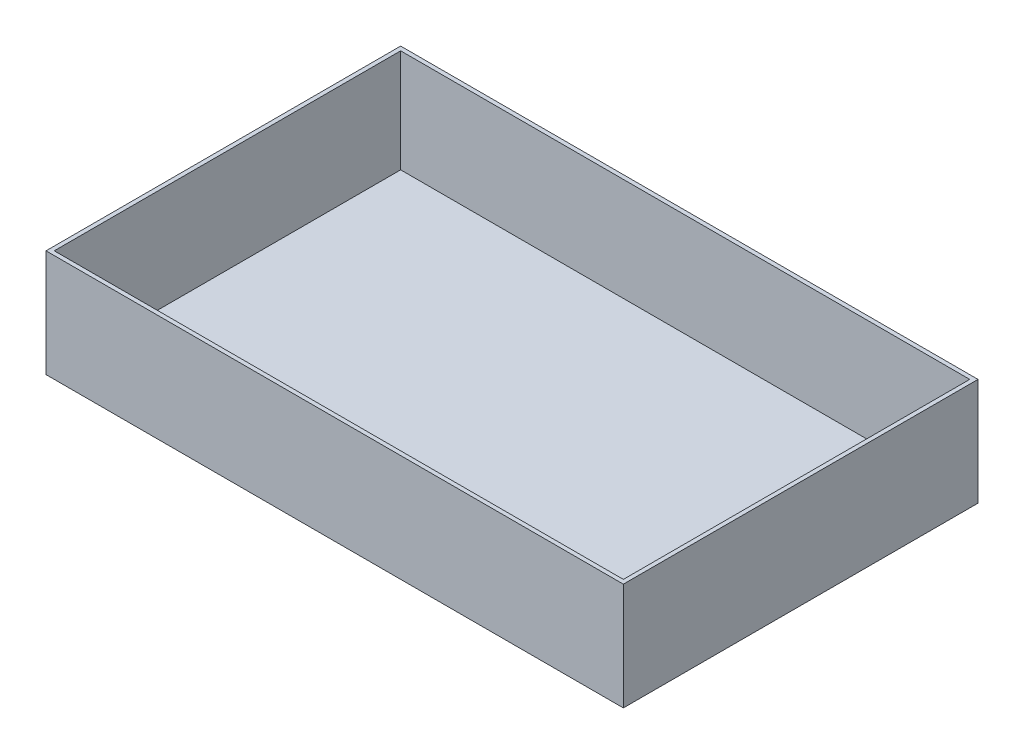
ISO-10303-21;
HEADER;
FILE_DESCRIPTION(('STEP AP214'),'2;1');
FILE_NAME('part.step','',(''),(''),'','','');
FILE_SCHEMA(('AUTOMOTIVE_DESIGN { 1 0 10303 214 1 1 1 1 }'));
ENDSEC;
DATA;
#1=APPLICATION_CONTEXT('core data for automotive mechanical design processes');
#2=APPLICATION_PROTOCOL_DEFINITION('international standard','automotive_design',2000,#1);
#3=PRODUCT_CONTEXT('',#1,'mechanical');
#4=PRODUCT('Part','Part','',(#3));
#5=PRODUCT_RELATED_PRODUCT_CATEGORY('part','',(#4));
#6=PRODUCT_DEFINITION_FORMATION('','',#4);
#7=PRODUCT_DEFINITION_CONTEXT('part definition',#1,'design');
#8=PRODUCT_DEFINITION('design','',#6,#7);
#9=PRODUCT_DEFINITION_SHAPE('','',#8);
#10=(LENGTH_UNIT() NAMED_UNIT(*) SI_UNIT(.MILLI.,.METRE.));
#11=(NAMED_UNIT(*) PLANE_ANGLE_UNIT() SI_UNIT($,.RADIAN.));
#12=(NAMED_UNIT(*) SI_UNIT($,.STERADIAN.) SOLID_ANGLE_UNIT());
#13=UNCERTAINTY_MEASURE_WITH_UNIT(LENGTH_MEASURE(1.E-05),#10,'distance_accuracy_value','');
#14=(GEOMETRIC_REPRESENTATION_CONTEXT(3) GLOBAL_UNCERTAINTY_ASSIGNED_CONTEXT((#13)) GLOBAL_UNIT_ASSIGNED_CONTEXT((#10,
#11,#12)) REPRESENTATION_CONTEXT('',''));
#15=CARTESIAN_POINT('',(0.,0.,0.));
#16=DIRECTION('',(0.,0.,1.));
#17=DIRECTION('',(1.,0.,0.));
#18=AXIS2_PLACEMENT_3D('',#15,#16,#17);
#19=CARTESIAN_POINT('',(350.,130.,-215.));
#20=DIRECTION('',(-1.,0.,0.));
#21=DIRECTION('',(0.,0.,1.));
#22=AXIS2_PLACEMENT_3D('',#19,#20,#21);
#23=PLANE('',#22);
#24=DIRECTION('',(0.,0.,-1.));
#25=VECTOR('',#24,1.);
#26=CARTESIAN_POINT('',(350.,0.,-215.));
#27=LINE('',#26,#25);
#28=CARTESIAN_POINT('',(350.,0.,215.));
#29=VERTEX_POINT('',#28);
#30=CARTESIAN_POINT('',(350.,0.,-215.));
#31=VERTEX_POINT('',#30);
#32=EDGE_CURVE('E149',#29,#31,#27,.T.);
#33=ORIENTED_EDGE('',*,*,#32,.T.);
#34=DIRECTION('',(0.,-1.,0.));
#35=VECTOR('',#34,1.);
#36=CARTESIAN_POINT('',(350.,130.,-215.));
#37=LINE('',#36,#35);
#38=CARTESIAN_POINT('',(350.,130.,-215.));
#39=VERTEX_POINT('',#38);
#40=EDGE_CURVE('E11',#39,#31,#37,.T.);
#41=ORIENTED_EDGE('',*,*,#40,.F.);
#42=DIRECTION('',(0.,0.,-1.));
#43=VECTOR('',#42,1.);
#44=CARTESIAN_POINT('',(350.,130.,-215.));
#45=LINE('',#44,#43);
#46=CARTESIAN_POINT('',(350.,130.,215.));
#47=VERTEX_POINT('',#46);
#48=EDGE_CURVE('E142',#47,#39,#45,.T.);
#49=ORIENTED_EDGE('',*,*,#48,.F.);
#50=DIRECTION('',(0.,-1.,0.));
#51=VECTOR('',#50,1.);
#52=CARTESIAN_POINT('',(350.,130.,215.));
#53=LINE('',#52,#51);
#54=EDGE_CURVE('E148',#47,#29,#53,.T.);
#55=ORIENTED_EDGE('',*,*,#54,.T.);
#56=EDGE_LOOP('',(#33,#41,#49,#55));
#57=FACE_BOUND('',#56,.T.);
#58=ADVANCED_FACE('F35',(#57),#23,.F.);
#59=CARTESIAN_POINT('',(-350.,130.,-215.));
#60=DIRECTION('',(0.,0.,1.));
#61=DIRECTION('',(1.,0.,0.));
#62=AXIS2_PLACEMENT_3D('',#59,#60,#61);
#63=PLANE('',#62);
#64=DIRECTION('',(-1.,0.,0.));
#65=VECTOR('',#64,1.);
#66=CARTESIAN_POINT('',(-350.,0.,-215.));
#67=LINE('',#66,#65);
#68=CARTESIAN_POINT('',(-350.,0.,-215.));
#69=VERTEX_POINT('',#68);
#70=EDGE_CURVE('E152',#31,#69,#67,.T.);
#71=ORIENTED_EDGE('',*,*,#70,.T.);
#72=DIRECTION('',(0.,-1.,0.));
#73=VECTOR('',#72,1.);
#74=CARTESIAN_POINT('',(-350.,130.,-215.));
#75=LINE('',#74,#73);
#76=CARTESIAN_POINT('',(-350.,130.,-215.));
#77=VERTEX_POINT('',#76);
#78=EDGE_CURVE('E42',#77,#69,#75,.T.);
#79=ORIENTED_EDGE('',*,*,#78,.F.);
#80=DIRECTION('',(-1.,0.,0.));
#81=VECTOR('',#80,1.);
#82=CARTESIAN_POINT('',(-350.,130.,-215.));
#83=LINE('',#82,#81);
#84=EDGE_CURVE('E86',#39,#77,#83,.T.);
#85=ORIENTED_EDGE('',*,*,#84,.F.);
#86=ORIENTED_EDGE('',*,*,#40,.T.);
#87=EDGE_LOOP('',(#71,#79,#85,#86));
#88=FACE_BOUND('',#87,.T.);
#89=ADVANCED_FACE('F181',(#88),#63,.F.);
#90=CARTESIAN_POINT('',(-350.,130.,-215.));
#91=DIRECTION('',(1.,0.,0.));
#92=DIRECTION('',(0.,0.,-1.));
#93=AXIS2_PLACEMENT_3D('',#90,#91,#92);
#94=PLANE('',#93);
#95=DIRECTION('',(0.,0.,1.));
#96=VECTOR('',#95,1.);
#97=CARTESIAN_POINT('',(-350.,0.,-215.));
#98=LINE('',#97,#96);
#99=CARTESIAN_POINT('',(-350.,0.,215.));
#100=VERTEX_POINT('',#99);
#101=EDGE_CURVE('E154',#69,#100,#98,.T.);
#102=ORIENTED_EDGE('',*,*,#101,.T.);
#103=DIRECTION('',(0.,-1.,0.));
#104=VECTOR('',#103,1.);
#105=CARTESIAN_POINT('',(-350.,130.,215.));
#106=LINE('',#105,#104);
#107=CARTESIAN_POINT('',(-350.,130.,215.));
#108=VERTEX_POINT('',#107);
#109=EDGE_CURVE('E158',#108,#100,#106,.T.);
#110=ORIENTED_EDGE('',*,*,#109,.F.);
#111=DIRECTION('',(0.,0.,1.));
#112=VECTOR('',#111,1.);
#113=CARTESIAN_POINT('',(-350.,130.,-215.));
#114=LINE('',#113,#112);
#115=EDGE_CURVE('E145',#77,#108,#114,.T.);
#116=ORIENTED_EDGE('',*,*,#115,.F.);
#117=ORIENTED_EDGE('',*,*,#78,.T.);
#118=EDGE_LOOP('',(#102,#110,#116,#117));
#119=FACE_BOUND('',#118,.T.);
#120=ADVANCED_FACE('F163',(#119),#94,.F.);
#121=CARTESIAN_POINT('',(-350.,130.,215.));
#122=DIRECTION('',(0.,0.,-1.));
#123=DIRECTION('',(-1.,0.,0.));
#124=AXIS2_PLACEMENT_3D('',#121,#122,#123);
#125=PLANE('',#124);
#126=DIRECTION('',(1.,0.,0.));
#127=VECTOR('',#126,1.);
#128=CARTESIAN_POINT('',(-350.,0.,215.));
#129=LINE('',#128,#127);
#130=EDGE_CURVE('E79',#100,#29,#129,.T.);
#131=ORIENTED_EDGE('',*,*,#130,.T.);
#132=ORIENTED_EDGE('',*,*,#54,.F.);
#133=DIRECTION('',(1.,0.,0.));
#134=VECTOR('',#133,1.);
#135=CARTESIAN_POINT('',(-350.,130.,215.));
#136=LINE('',#135,#134);
#137=EDGE_CURVE('E58',#108,#47,#136,.T.);
#138=ORIENTED_EDGE('',*,*,#137,.F.);
#139=ORIENTED_EDGE('',*,*,#109,.T.);
#140=EDGE_LOOP('',(#131,#132,#138,#139));
#141=FACE_BOUND('',#140,.T.);
#142=ADVANCED_FACE('F171',(#141),#125,.F.);
#143=CARTESIAN_POINT('',(0.,130.,0.));
#144=DIRECTION('',(0.,1.,0.));
#145=DIRECTION('',(0.,0.,1.));
#146=AXIS2_PLACEMENT_3D('',#143,#144,#145);
#147=PLANE('',#146);
#148=DIRECTION('',(0.,0.,-1.));
#149=VECTOR('',#148,1.);
#150=CARTESIAN_POINT('',(345.,130.,-215.));
#151=LINE('',#150,#149);
#152=CARTESIAN_POINT('',(345.,130.,210.));
#153=VERTEX_POINT('',#152);
#154=CARTESIAN_POINT('',(345.,130.,-210.));
#155=VERTEX_POINT('',#154);
#156=EDGE_CURVE('E131',#153,#155,#151,.T.);
#157=ORIENTED_EDGE('',*,*,#156,.F.);
#158=DIRECTION('',(1.,0.,0.));
#159=VECTOR('',#158,1.);
#160=CARTESIAN_POINT('',(-350.,130.,210.));
#161=LINE('',#160,#159);
#162=CARTESIAN_POINT('',(-345.,130.,210.));
#163=VERTEX_POINT('',#162);
#164=EDGE_CURVE('E140',#163,#153,#161,.T.);
#165=ORIENTED_EDGE('',*,*,#164,.F.);
#166=DIRECTION('',(0.,0.,1.));
#167=VECTOR('',#166,1.);
#168=CARTESIAN_POINT('',(-345.,130.,-215.));
#169=LINE('',#168,#167);
#170=CARTESIAN_POINT('',(-345.,130.,-210.));
#171=VERTEX_POINT('',#170);
#172=EDGE_CURVE('E138',#171,#163,#169,.T.);
#173=ORIENTED_EDGE('',*,*,#172,.F.);
#174=DIRECTION('',(-1.,0.,0.));
#175=VECTOR('',#174,1.);
#176=CARTESIAN_POINT('',(-350.,130.,-210.));
#177=LINE('',#176,#175);
#178=EDGE_CURVE('E123',#155,#171,#177,.T.);
#179=ORIENTED_EDGE('',*,*,#178,.F.);
#180=EDGE_LOOP('',(#157,#165,#173,#179));
#181=FACE_BOUND('',#180,.T.);
#182=ORIENTED_EDGE('',*,*,#48,.T.);
#183=ORIENTED_EDGE('',*,*,#84,.T.);
#184=ORIENTED_EDGE('',*,*,#115,.T.);
#185=ORIENTED_EDGE('',*,*,#137,.T.);
#186=EDGE_LOOP('',(#182,#183,#184,#185));
#187=FACE_BOUND('',#186,.T.);
#188=ADVANCED_FACE('F173',(#181,#187),#147,.T.);
#189=CARTESIAN_POINT('',(0.,0.,0.));
#190=DIRECTION('',(0.,1.,0.));
#191=DIRECTION('',(0.,0.,1.));
#192=AXIS2_PLACEMENT_3D('',#189,#190,#191);
#193=PLANE('',#192);
#194=ORIENTED_EDGE('',*,*,#32,.F.);
#195=ORIENTED_EDGE('',*,*,#130,.F.);
#196=ORIENTED_EDGE('',*,*,#101,.F.);
#197=ORIENTED_EDGE('',*,*,#70,.F.);
#198=EDGE_LOOP('',(#194,#195,#196,#197));
#199=FACE_BOUND('',#198,.T.);
#200=ADVANCED_FACE('F167',(#199),#193,.F.);
#201=CARTESIAN_POINT('',(345.,130.,-215.));
#202=DIRECTION('',(-1.,0.,0.));
#203=DIRECTION('',(0.,0.,1.));
#204=AXIS2_PLACEMENT_3D('',#201,#202,#203);
#205=PLANE('',#204);
#206=DIRECTION('',(0.,0.,-1.));
#207=VECTOR('',#206,1.);
#208=CARTESIAN_POINT('',(345.,5.,-215.));
#209=LINE('',#208,#207);
#210=CARTESIAN_POINT('',(345.,5.,210.));
#211=VERTEX_POINT('',#210);
#212=CARTESIAN_POINT('',(345.,5.,-210.));
#213=VERTEX_POINT('',#212);
#214=EDGE_CURVE('E114',#211,#213,#209,.T.);
#215=ORIENTED_EDGE('',*,*,#214,.F.);
#216=DIRECTION('',(0.,-1.,0.));
#217=VECTOR('',#216,1.);
#218=CARTESIAN_POINT('',(345.,130.,210.));
#219=LINE('',#218,#217);
#220=EDGE_CURVE('E134',#153,#211,#219,.T.);
#221=ORIENTED_EDGE('',*,*,#220,.F.);
#222=ORIENTED_EDGE('',*,*,#156,.T.);
#223=DIRECTION('',(0.,-1.,0.));
#224=VECTOR('',#223,1.);
#225=CARTESIAN_POINT('',(345.,130.,-210.));
#226=LINE('',#225,#224);
#227=EDGE_CURVE('E126',#155,#213,#226,.T.);
#228=ORIENTED_EDGE('',*,*,#227,.T.);
#229=EDGE_LOOP('',(#215,#221,#222,#228));
#230=FACE_BOUND('',#229,.T.);
#231=ADVANCED_FACE('F208',(#230),#205,.T.);
#232=CARTESIAN_POINT('',(-350.,130.,-210.));
#233=DIRECTION('',(0.,0.,1.));
#234=DIRECTION('',(1.,0.,0.));
#235=AXIS2_PLACEMENT_3D('',#232,#233,#234);
#236=PLANE('',#235);
#237=DIRECTION('',(-1.,0.,0.));
#238=VECTOR('',#237,1.);
#239=CARTESIAN_POINT('',(-350.,5.,-210.));
#240=LINE('',#239,#238);
#241=CARTESIAN_POINT('',(-345.,5.,-210.));
#242=VERTEX_POINT('',#241);
#243=EDGE_CURVE('E108',#213,#242,#240,.T.);
#244=ORIENTED_EDGE('',*,*,#243,.F.);
#245=ORIENTED_EDGE('',*,*,#227,.F.);
#246=ORIENTED_EDGE('',*,*,#178,.T.);
#247=DIRECTION('',(0.,-1.,0.));
#248=VECTOR('',#247,1.);
#249=CARTESIAN_POINT('',(-345.,130.,-210.));
#250=LINE('',#249,#248);
#251=EDGE_CURVE('E120',#171,#242,#250,.T.);
#252=ORIENTED_EDGE('',*,*,#251,.T.);
#253=EDGE_LOOP('',(#244,#245,#246,#252));
#254=FACE_BOUND('',#253,.T.);
#255=ADVANCED_FACE('F121',(#254),#236,.T.);
#256=CARTESIAN_POINT('',(-345.,130.,-215.));
#257=DIRECTION('',(1.,0.,0.));
#258=DIRECTION('',(0.,0.,-1.));
#259=AXIS2_PLACEMENT_3D('',#256,#257,#258);
#260=PLANE('',#259);
#261=DIRECTION('',(0.,0.,1.));
#262=VECTOR('',#261,1.);
#263=CARTESIAN_POINT('',(-345.,5.,-215.));
#264=LINE('',#263,#262);
#265=CARTESIAN_POINT('',(-345.,5.,210.));
#266=VERTEX_POINT('',#265);
#267=EDGE_CURVE('E112',#242,#266,#264,.T.);
#268=ORIENTED_EDGE('',*,*,#267,.F.);
#269=ORIENTED_EDGE('',*,*,#251,.F.);
#270=ORIENTED_EDGE('',*,*,#172,.T.);
#271=DIRECTION('',(0.,-1.,0.));
#272=VECTOR('',#271,1.);
#273=CARTESIAN_POINT('',(-345.,130.,210.));
#274=LINE('',#273,#272);
#275=EDGE_CURVE('E49',#163,#266,#274,.T.);
#276=ORIENTED_EDGE('',*,*,#275,.T.);
#277=EDGE_LOOP('',(#268,#269,#270,#276));
#278=FACE_BOUND('',#277,.T.);
#279=ADVANCED_FACE('F128',(#278),#260,.T.);
#280=CARTESIAN_POINT('',(-350.,130.,210.));
#281=DIRECTION('',(0.,0.,-1.));
#282=DIRECTION('',(-1.,0.,0.));
#283=AXIS2_PLACEMENT_3D('',#280,#281,#282);
#284=PLANE('',#283);
#285=DIRECTION('',(1.,0.,0.));
#286=VECTOR('',#285,1.);
#287=CARTESIAN_POINT('',(-350.,5.,210.));
#288=LINE('',#287,#286);
#289=EDGE_CURVE('E129',#266,#211,#288,.T.);
#290=ORIENTED_EDGE('',*,*,#289,.F.);
#291=ORIENTED_EDGE('',*,*,#275,.F.);
#292=ORIENTED_EDGE('',*,*,#164,.T.);
#293=ORIENTED_EDGE('',*,*,#220,.T.);
#294=EDGE_LOOP('',(#290,#291,#292,#293));
#295=FACE_BOUND('',#294,.T.);
#296=ADVANCED_FACE('F238',(#295),#284,.T.);
#297=CARTESIAN_POINT('',(0.,5.,0.));
#298=DIRECTION('',(0.,1.,0.));
#299=DIRECTION('',(0.,0.,1.));
#300=AXIS2_PLACEMENT_3D('',#297,#298,#299);
#301=PLANE('',#300);
#302=ORIENTED_EDGE('',*,*,#214,.T.);
#303=ORIENTED_EDGE('',*,*,#243,.T.);
#304=ORIENTED_EDGE('',*,*,#267,.T.);
#305=ORIENTED_EDGE('',*,*,#289,.T.);
#306=EDGE_LOOP('',(#302,#303,#304,#305));
#307=FACE_BOUND('',#306,.T.);
#308=ADVANCED_FACE('F110',(#307),#301,.T.);
#309=CLOSED_SHELL('',(#58,#89,#120,#142,#188,#200,#231,#255,#279,#296,#308));
#310=MANIFOLD_SOLID_BREP('B2',#309);
#311=ADVANCED_BREP_SHAPE_REPRESENTATION('',(#18,#310),#14);
#312=SHAPE_DEFINITION_REPRESENTATION(#9,#311);
ENDSEC;
END-ISO-10303-21;
